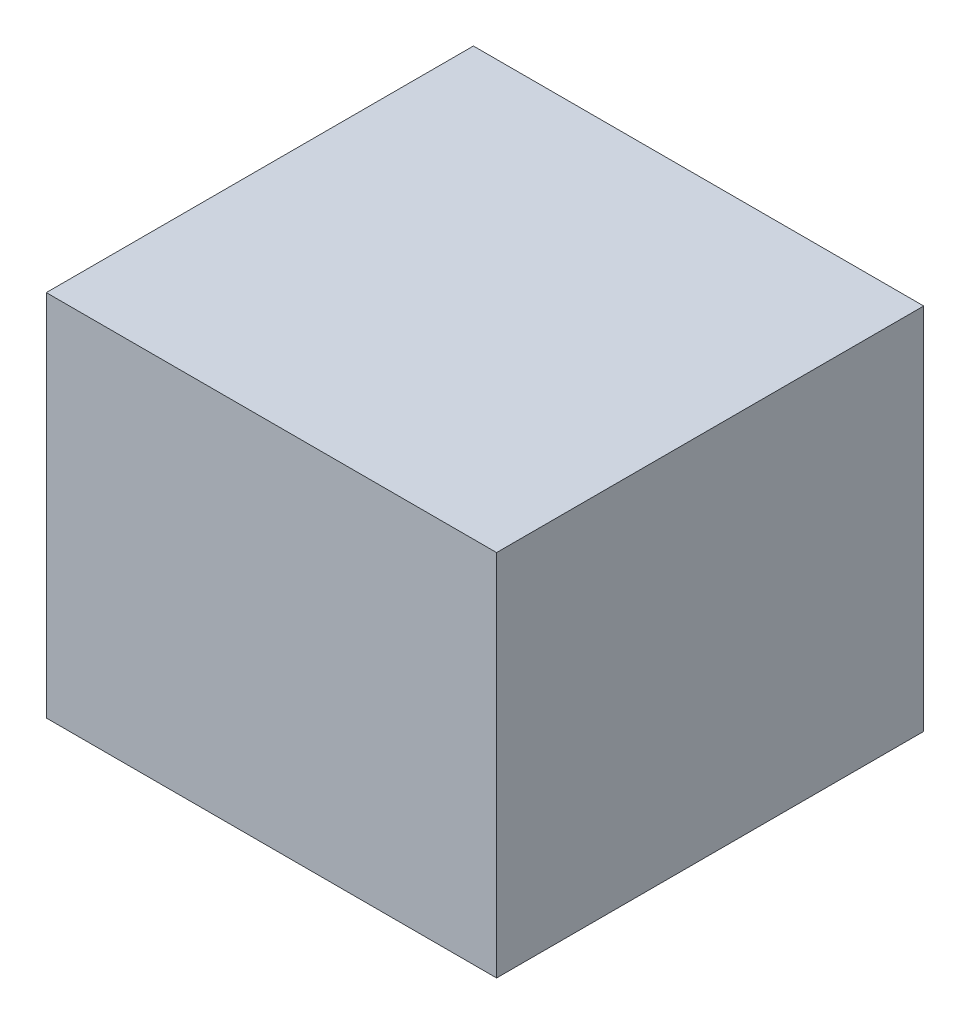
ISO-10303-21;
HEADER;
FILE_DESCRIPTION(('STEP AP214'),'2;1');
FILE_NAME('part.step','',(''),(''),'','','');
FILE_SCHEMA(('AUTOMOTIVE_DESIGN { 1 0 10303 214 1 1 1 1 }'));
ENDSEC;
DATA;
#1=APPLICATION_CONTEXT('core data for automotive mechanical design processes');
#2=APPLICATION_PROTOCOL_DEFINITION('international standard','automotive_design',2000,#1);
#3=PRODUCT_CONTEXT('',#1,'mechanical');
#4=PRODUCT('Part','Part','',(#3));
#5=PRODUCT_RELATED_PRODUCT_CATEGORY('part','',(#4));
#6=PRODUCT_DEFINITION_FORMATION('','',#4);
#7=PRODUCT_DEFINITION_CONTEXT('part definition',#1,'design');
#8=PRODUCT_DEFINITION('design','',#6,#7);
#9=PRODUCT_DEFINITION_SHAPE('','',#8);
#10=(LENGTH_UNIT() NAMED_UNIT(*) SI_UNIT(.MILLI.,.METRE.));
#11=(NAMED_UNIT(*) PLANE_ANGLE_UNIT() SI_UNIT($,.RADIAN.));
#12=(NAMED_UNIT(*) SI_UNIT($,.STERADIAN.) SOLID_ANGLE_UNIT());
#13=UNCERTAINTY_MEASURE_WITH_UNIT(LENGTH_MEASURE(1.E-05),#10,'distance_accuracy_value','');
#14=(GEOMETRIC_REPRESENTATION_CONTEXT(3) GLOBAL_UNCERTAINTY_ASSIGNED_CONTEXT((#13)) GLOBAL_UNIT_ASSIGNED_CONTEXT((#10,
#11,#12)) REPRESENTATION_CONTEXT('',''));
#15=CARTESIAN_POINT('',(0.,0.,0.));
#16=DIRECTION('',(0.,0.,1.));
#17=DIRECTION('',(1.,0.,0.));
#18=AXIS2_PLACEMENT_3D('',#15,#16,#17);
#19=CARTESIAN_POINT('',(8.25,-6.75,15.65));
#20=DIRECTION('',(-1.,0.,0.));
#21=DIRECTION('',(0.,0.,1.));
#22=AXIS2_PLACEMENT_3D('',#19,#20,#21);
#23=PLANE('',#22);
#24=DIRECTION('',(0.,1.,0.));
#25=VECTOR('',#24,1.);
#26=CARTESIAN_POINT('',(8.25,-6.75,0.));
#27=LINE('',#26,#25);
#28=CARTESIAN_POINT('',(8.25,-6.75,0.));
#29=VERTEX_POINT('',#28);
#30=CARTESIAN_POINT('',(8.25,6.75,0.));
#31=VERTEX_POINT('',#30);
#32=EDGE_CURVE('E137',#29,#31,#27,.T.);
#33=ORIENTED_EDGE('',*,*,#32,.T.);
#34=DIRECTION('',(0.,0.,-1.));
#35=VECTOR('',#34,1.);
#36=CARTESIAN_POINT('',(8.25,6.75,15.65));
#37=LINE('',#36,#35);
#38=CARTESIAN_POINT('',(8.25,6.75,15.65));
#39=VERTEX_POINT('',#38);
#40=EDGE_CURVE('E11',#39,#31,#37,.T.);
#41=ORIENTED_EDGE('',*,*,#40,.F.);
#42=DIRECTION('',(0.,1.,0.));
#43=VECTOR('',#42,1.);
#44=CARTESIAN_POINT('',(8.25,-6.75,15.65));
#45=LINE('',#44,#43);
#46=CARTESIAN_POINT('',(8.25,-6.75,15.65));
#47=VERTEX_POINT('',#46);
#48=EDGE_CURVE('E200',#47,#39,#45,.T.);
#49=ORIENTED_EDGE('',*,*,#48,.F.);
#50=DIRECTION('',(0.,0.,-1.));
#51=VECTOR('',#50,1.);
#52=CARTESIAN_POINT('',(8.25,-6.75,15.65));
#53=LINE('',#52,#51);
#54=EDGE_CURVE('E206',#47,#29,#53,.T.);
#55=ORIENTED_EDGE('',*,*,#54,.T.);
#56=EDGE_LOOP('',(#33,#41,#49,#55));
#57=FACE_BOUND('',#56,.T.);
#58=ADVANCED_FACE('F33',(#57),#23,.F.);
#59=CARTESIAN_POINT('',(-8.25,6.75,15.65));
#60=DIRECTION('',(0.,-1.,0.));
#61=DIRECTION('',(0.,0.,-1.));
#62=AXIS2_PLACEMENT_3D('',#59,#60,#61);
#63=PLANE('',#62);
#64=DIRECTION('',(-1.,0.,0.));
#65=VECTOR('',#64,1.);
#66=CARTESIAN_POINT('',(-8.25,6.75,0.));
#67=LINE('',#66,#65);
#68=CARTESIAN_POINT('',(-8.25,6.75,0.));
#69=VERTEX_POINT('',#68);
#70=EDGE_CURVE('E209',#31,#69,#67,.T.);
#71=ORIENTED_EDGE('',*,*,#70,.T.);
#72=DIRECTION('',(0.,0.,-1.));
#73=VECTOR('',#72,1.);
#74=CARTESIAN_POINT('',(-8.25,6.75,15.65));
#75=LINE('',#74,#73);
#76=CARTESIAN_POINT('',(-8.25,6.75,15.65));
#77=VERTEX_POINT('',#76);
#78=EDGE_CURVE('E40',#77,#69,#75,.T.);
#79=ORIENTED_EDGE('',*,*,#78,.F.);
#80=DIRECTION('',(-1.,0.,0.));
#81=VECTOR('',#80,1.);
#82=CARTESIAN_POINT('',(-8.25,6.75,15.65));
#83=LINE('',#82,#81);
#84=EDGE_CURVE('E84',#39,#77,#83,.T.);
#85=ORIENTED_EDGE('',*,*,#84,.F.);
#86=ORIENTED_EDGE('',*,*,#40,.T.);
#87=EDGE_LOOP('',(#71,#79,#85,#86));
#88=FACE_BOUND('',#87,.T.);
#89=ADVANCED_FACE('F237',(#88),#63,.F.);
#90=CARTESIAN_POINT('',(-8.25,-6.75,15.65));
#91=DIRECTION('',(1.,0.,0.));
#92=DIRECTION('',(0.,0.,-1.));
#93=AXIS2_PLACEMENT_3D('',#90,#91,#92);
#94=PLANE('',#93);
#95=DIRECTION('',(0.,-1.,0.));
#96=VECTOR('',#95,1.);
#97=CARTESIAN_POINT('',(-8.25,-6.75,0.));
#98=LINE('',#97,#96);
#99=CARTESIAN_POINT('',(-8.25,-6.75,0.));
#100=VERTEX_POINT('',#99);
#101=EDGE_CURVE('E211',#69,#100,#98,.T.);
#102=ORIENTED_EDGE('',*,*,#101,.T.);
#103=DIRECTION('',(0.,0.,-1.));
#104=VECTOR('',#103,1.);
#105=CARTESIAN_POINT('',(-8.25,-6.75,15.65));
#106=LINE('',#105,#104);
#107=CARTESIAN_POINT('',(-8.25,-6.75,15.65));
#108=VERTEX_POINT('',#107);
#109=EDGE_CURVE('E215',#108,#100,#106,.T.);
#110=ORIENTED_EDGE('',*,*,#109,.F.);
#111=DIRECTION('',(0.,-1.,0.));
#112=VECTOR('',#111,1.);
#113=CARTESIAN_POINT('',(-8.25,-6.75,15.65));
#114=LINE('',#113,#112);
#115=EDGE_CURVE('E203',#77,#108,#114,.T.);
#116=ORIENTED_EDGE('',*,*,#115,.F.);
#117=ORIENTED_EDGE('',*,*,#78,.T.);
#118=EDGE_LOOP('',(#102,#110,#116,#117));
#119=FACE_BOUND('',#118,.T.);
#120=ADVANCED_FACE('F220',(#119),#94,.F.);
#121=CARTESIAN_POINT('',(-8.25,-6.75,15.65));
#122=DIRECTION('',(0.,1.,0.));
#123=DIRECTION('',(0.,0.,1.));
#124=AXIS2_PLACEMENT_3D('',#121,#122,#123);
#125=PLANE('',#124);
#126=DIRECTION('',(1.,0.,0.));
#127=VECTOR('',#126,1.);
#128=CARTESIAN_POINT('',(-8.25,-6.75,0.));
#129=LINE('',#128,#127);
#130=EDGE_CURVE('E77',#100,#29,#129,.T.);
#131=ORIENTED_EDGE('',*,*,#130,.T.);
#132=ORIENTED_EDGE('',*,*,#54,.F.);
#133=DIRECTION('',(1.,0.,0.));
#134=VECTOR('',#133,1.);
#135=CARTESIAN_POINT('',(-8.25,-6.75,15.65));
#136=LINE('',#135,#134);
#137=EDGE_CURVE('E56',#108,#47,#136,.T.);
#138=ORIENTED_EDGE('',*,*,#137,.F.);
#139=ORIENTED_EDGE('',*,*,#109,.T.);
#140=EDGE_LOOP('',(#131,#132,#138,#139));
#141=FACE_BOUND('',#140,.T.);
#142=ADVANCED_FACE('F228',(#141),#125,.F.);
#143=CARTESIAN_POINT('',(0.,0.,15.65));
#144=DIRECTION('',(0.,0.,-1.));
#145=DIRECTION('',(-1.,0.,0.));
#146=AXIS2_PLACEMENT_3D('',#143,#144,#145);
#147=PLANE('',#146);
#148=ORIENTED_EDGE('',*,*,#48,.T.);
#149=ORIENTED_EDGE('',*,*,#84,.T.);
#150=ORIENTED_EDGE('',*,*,#115,.T.);
#151=ORIENTED_EDGE('',*,*,#137,.T.);
#152=EDGE_LOOP('',(#148,#149,#150,#151));
#153=FACE_BOUND('',#152,.T.);
#154=ADVANCED_FACE('F230',(#153),#147,.F.);
#155=CARTESIAN_POINT('',(0.,0.,0.));
#156=DIRECTION('',(0.,0.,-1.));
#157=DIRECTION('',(-1.,0.,0.));
#158=AXIS2_PLACEMENT_3D('',#155,#156,#157);
#159=PLANE('',#158);
#160=DIRECTION('',(1.,0.,0.));
#161=VECTOR('',#160,1.);
#162=CARTESIAN_POINT('',(0.,3.15,0.));
#163=LINE('',#162,#161);
#164=CARTESIAN_POINT('',(3.2,3.15,0.));
#165=VERTEX_POINT('',#164);
#166=CARTESIAN_POINT('',(6.25,3.15,0.));
#167=VERTEX_POINT('',#166);
#168=EDGE_CURVE('E47',#165,#167,#163,.T.);
#169=ORIENTED_EDGE('',*,*,#168,.F.);
#170=DIRECTION('',(0.,1.,0.));
#171=VECTOR('',#170,1.);
#172=CARTESIAN_POINT('',(3.2,0.,0.));
#173=LINE('',#172,#171);
#174=CARTESIAN_POINT('',(3.2,5.75,0.));
#175=VERTEX_POINT('',#174);
#176=EDGE_CURVE('E135',#165,#175,#173,.T.);
#177=ORIENTED_EDGE('',*,*,#176,.T.);
#178=DIRECTION('',(1.,0.,0.));
#179=VECTOR('',#178,1.);
#180=CARTESIAN_POINT('',(0.,5.75,0.));
#181=LINE('',#180,#179);
#182=CARTESIAN_POINT('',(-3.2,5.75,0.));
#183=VERTEX_POINT('',#182);
#184=EDGE_CURVE('E177',#183,#175,#181,.T.);
#185=ORIENTED_EDGE('',*,*,#184,.F.);
#186=DIRECTION('',(0.,1.,0.));
#187=VECTOR('',#186,1.);
#188=CARTESIAN_POINT('',(-3.2,0.,0.));
#189=LINE('',#188,#187);
#190=CARTESIAN_POINT('',(-3.2,3.15,0.));
#191=VERTEX_POINT('',#190);
#192=EDGE_CURVE('E180',#191,#183,#189,.T.);
#193=ORIENTED_EDGE('',*,*,#192,.F.);
#194=CARTESIAN_POINT('',(-6.25,3.15,0.));
#195=VERTEX_POINT('',#194);
#196=EDGE_CURVE('E175',#195,#191,#163,.T.);
#197=ORIENTED_EDGE('',*,*,#196,.F.);
#198=DIRECTION('',(0.,-1.,0.));
#199=VECTOR('',#198,1.);
#200=CARTESIAN_POINT('',(-6.25,0.,0.));
#201=LINE('',#200,#199);
#202=CARTESIAN_POINT('',(-6.25,-4.85,0.));
#203=VERTEX_POINT('',#202);
#204=EDGE_CURVE('E183',#195,#203,#201,.T.);
#205=ORIENTED_EDGE('',*,*,#204,.T.);
#206=DIRECTION('',(-1.,0.,0.));
#207=VECTOR('',#206,1.);
#208=CARTESIAN_POINT('',(0.,-4.85,0.));
#209=LINE('',#208,#207);
#210=CARTESIAN_POINT('',(6.25,-4.85,0.));
#211=VERTEX_POINT('',#210);
#212=EDGE_CURVE('E157',#211,#203,#209,.T.);
#213=ORIENTED_EDGE('',*,*,#212,.F.);
#214=DIRECTION('',(0.,-1.,0.));
#215=VECTOR('',#214,1.);
#216=CARTESIAN_POINT('',(6.25,0.,0.));
#217=LINE('',#216,#215);
#218=EDGE_CURVE('E153',#167,#211,#217,.T.);
#219=ORIENTED_EDGE('',*,*,#218,.F.);
#220=EDGE_LOOP('',(#169,#177,#185,#193,#197,#205,#213,#219));
#221=FACE_BOUND('',#220,.T.);
#222=ORIENTED_EDGE('',*,*,#32,.F.);
#223=ORIENTED_EDGE('',*,*,#130,.F.);
#224=ORIENTED_EDGE('',*,*,#101,.F.);
#225=ORIENTED_EDGE('',*,*,#70,.F.);
#226=EDGE_LOOP('',(#222,#223,#224,#225));
#227=FACE_BOUND('',#226,.T.);
#228=ADVANCED_FACE('F224',(#221,#227),#159,.T.);
#229=CARTESIAN_POINT('',(0.,3.15,10.));
#230=DIRECTION('',(0.,1.,0.));
#231=DIRECTION('',(0.,0.,1.));
#232=AXIS2_PLACEMENT_3D('',#229,#230,#231);
#233=PLANE('',#232);
#234=ORIENTED_EDGE('',*,*,#168,.T.);
#235=DIRECTION('',(0.,0.,-1.));
#236=VECTOR('',#235,1.);
#237=CARTESIAN_POINT('',(6.25,3.15,10.));
#238=LINE('',#237,#236);
#239=CARTESIAN_POINT('',(6.25,3.15,10.));
#240=VERTEX_POINT('',#239);
#241=EDGE_CURVE('E152',#240,#167,#238,.T.);
#242=ORIENTED_EDGE('',*,*,#241,.F.);
#243=DIRECTION('',(1.,0.,0.));
#244=VECTOR('',#243,1.);
#245=CARTESIAN_POINT('',(0.,3.15,10.));
#246=LINE('',#245,#244);
#247=CARTESIAN_POINT('',(3.2,3.15,10.));
#248=VERTEX_POINT('',#247);
#249=EDGE_CURVE('E145',#248,#240,#246,.T.);
#250=ORIENTED_EDGE('',*,*,#249,.F.);
#251=DIRECTION('',(0.,0.,-1.));
#252=VECTOR('',#251,1.);
#253=CARTESIAN_POINT('',(3.2,3.15,10.));
#254=LINE('',#253,#252);
#255=EDGE_CURVE('E129',#248,#165,#254,.T.);
#256=ORIENTED_EDGE('',*,*,#255,.T.);
#257=EDGE_LOOP('',(#234,#242,#250,#256));
#258=FACE_BOUND('',#257,.T.);
#259=ADVANCED_FACE('F151',(#258),#233,.F.);
#260=CARTESIAN_POINT('',(3.2,0.,10.));
#261=DIRECTION('',(-1.,0.,0.));
#262=DIRECTION('',(0.,0.,1.));
#263=AXIS2_PLACEMENT_3D('',#260,#261,#262);
#264=PLANE('',#263);
#265=ORIENTED_EDGE('',*,*,#176,.F.);
#266=ORIENTED_EDGE('',*,*,#255,.F.);
#267=DIRECTION('',(0.,1.,0.));
#268=VECTOR('',#267,1.);
#269=CARTESIAN_POINT('',(3.2,0.,10.));
#270=LINE('',#269,#268);
#271=CARTESIAN_POINT('',(3.2,5.75,10.));
#272=VERTEX_POINT('',#271);
#273=EDGE_CURVE('E132',#248,#272,#270,.T.);
#274=ORIENTED_EDGE('',*,*,#273,.T.);
#275=DIRECTION('',(0.,0.,-1.));
#276=VECTOR('',#275,1.);
#277=CARTESIAN_POINT('',(3.2,5.75,10.));
#278=LINE('',#277,#276);
#279=EDGE_CURVE('E138',#272,#175,#278,.T.);
#280=ORIENTED_EDGE('',*,*,#279,.T.);
#281=EDGE_LOOP('',(#265,#266,#274,#280));
#282=FACE_BOUND('',#281,.T.);
#283=ADVANCED_FACE('F131',(#282),#264,.T.);
#284=CARTESIAN_POINT('',(0.,5.75,10.));
#285=DIRECTION('',(0.,1.,0.));
#286=DIRECTION('',(0.,0.,1.));
#287=AXIS2_PLACEMENT_3D('',#284,#285,#286);
#288=PLANE('',#287);
#289=ORIENTED_EDGE('',*,*,#184,.T.);
#290=ORIENTED_EDGE('',*,*,#279,.F.);
#291=DIRECTION('',(1.,0.,0.));
#292=VECTOR('',#291,1.);
#293=CARTESIAN_POINT('',(0.,5.75,10.));
#294=LINE('',#293,#292);
#295=CARTESIAN_POINT('',(-3.2,5.75,10.));
#296=VERTEX_POINT('',#295);
#297=EDGE_CURVE('E149',#296,#272,#294,.T.);
#298=ORIENTED_EDGE('',*,*,#297,.F.);
#299=DIRECTION('',(0.,0.,-1.));
#300=VECTOR('',#299,1.);
#301=CARTESIAN_POINT('',(-3.2,5.75,10.));
#302=LINE('',#301,#300);
#303=EDGE_CURVE('E197',#296,#183,#302,.T.);
#304=ORIENTED_EDGE('',*,*,#303,.T.);
#305=EDGE_LOOP('',(#289,#290,#298,#304));
#306=FACE_BOUND('',#305,.T.);
#307=ADVANCED_FACE('F286',(#306),#288,.F.);
#308=CARTESIAN_POINT('',(-3.2,0.,10.));
#309=DIRECTION('',(-1.,0.,0.));
#310=DIRECTION('',(0.,0.,1.));
#311=AXIS2_PLACEMENT_3D('',#308,#309,#310);
#312=PLANE('',#311);
#313=ORIENTED_EDGE('',*,*,#192,.T.);
#314=ORIENTED_EDGE('',*,*,#303,.F.);
#315=DIRECTION('',(0.,1.,0.));
#316=VECTOR('',#315,1.);
#317=CARTESIAN_POINT('',(-3.2,0.,10.));
#318=LINE('',#317,#316);
#319=CARTESIAN_POINT('',(-3.2,3.15,10.));
#320=VERTEX_POINT('',#319);
#321=EDGE_CURVE('E161',#320,#296,#318,.T.);
#322=ORIENTED_EDGE('',*,*,#321,.F.);
#323=DIRECTION('',(0.,0.,-1.));
#324=VECTOR('',#323,1.);
#325=CARTESIAN_POINT('',(-3.2,3.15,10.));
#326=LINE('',#325,#324);
#327=EDGE_CURVE('E195',#320,#191,#326,.T.);
#328=ORIENTED_EDGE('',*,*,#327,.T.);
#329=EDGE_LOOP('',(#313,#314,#322,#328));
#330=FACE_BOUND('',#329,.T.);
#331=ADVANCED_FACE('F295',(#330),#312,.F.);
#332=ORIENTED_EDGE('',*,*,#196,.T.);
#333=ORIENTED_EDGE('',*,*,#327,.F.);
#334=CARTESIAN_POINT('',(-6.25,3.15,10.));
#335=VERTEX_POINT('',#334);
#336=EDGE_CURVE('E155',#335,#320,#246,.T.);
#337=ORIENTED_EDGE('',*,*,#336,.F.);
#338=DIRECTION('',(0.,0.,-1.));
#339=VECTOR('',#338,1.);
#340=CARTESIAN_POINT('',(-6.25,3.15,10.));
#341=LINE('',#340,#339);
#342=EDGE_CURVE('E193',#335,#195,#341,.T.);
#343=ORIENTED_EDGE('',*,*,#342,.T.);
#344=EDGE_LOOP('',(#332,#333,#337,#343));
#345=FACE_BOUND('',#344,.T.);
#346=ADVANCED_FACE('F278',(#345),#233,.F.);
#347=CARTESIAN_POINT('',(-6.25,0.,10.));
#348=DIRECTION('',(1.,0.,0.));
#349=DIRECTION('',(0.,0.,-1.));
#350=AXIS2_PLACEMENT_3D('',#347,#348,#349);
#351=PLANE('',#350);
#352=ORIENTED_EDGE('',*,*,#204,.F.);
#353=ORIENTED_EDGE('',*,*,#342,.F.);
#354=DIRECTION('',(0.,-1.,0.));
#355=VECTOR('',#354,1.);
#356=CARTESIAN_POINT('',(-6.25,0.,10.));
#357=LINE('',#356,#355);
#358=CARTESIAN_POINT('',(-6.25,-4.85,10.));
#359=VERTEX_POINT('',#358);
#360=EDGE_CURVE('E160',#335,#359,#357,.T.);
#361=ORIENTED_EDGE('',*,*,#360,.T.);
#362=DIRECTION('',(0.,0.,-1.));
#363=VECTOR('',#362,1.);
#364=CARTESIAN_POINT('',(-6.25,-4.85,10.));
#365=LINE('',#364,#363);
#366=EDGE_CURVE('E191',#359,#203,#365,.T.);
#367=ORIENTED_EDGE('',*,*,#366,.T.);
#368=EDGE_LOOP('',(#352,#353,#361,#367));
#369=FACE_BOUND('',#368,.T.);
#370=ADVANCED_FACE('F314',(#369),#351,.T.);
#371=CARTESIAN_POINT('',(0.,-4.85,10.));
#372=DIRECTION('',(0.,-1.,0.));
#373=DIRECTION('',(0.,0.,-1.));
#374=AXIS2_PLACEMENT_3D('',#371,#372,#373);
#375=PLANE('',#374);
#376=ORIENTED_EDGE('',*,*,#212,.T.);
#377=ORIENTED_EDGE('',*,*,#366,.F.);
#378=DIRECTION('',(-1.,0.,0.));
#379=VECTOR('',#378,1.);
#380=CARTESIAN_POINT('',(0.,-4.85,10.));
#381=LINE('',#380,#379);
#382=CARTESIAN_POINT('',(6.25,-4.85,10.));
#383=VERTEX_POINT('',#382);
#384=EDGE_CURVE('E164',#383,#359,#381,.T.);
#385=ORIENTED_EDGE('',*,*,#384,.F.);
#386=DIRECTION('',(0.,0.,-1.));
#387=VECTOR('',#386,1.);
#388=CARTESIAN_POINT('',(6.25,-4.85,10.));
#389=LINE('',#388,#387);
#390=EDGE_CURVE('E189',#383,#211,#389,.T.);
#391=ORIENTED_EDGE('',*,*,#390,.T.);
#392=EDGE_LOOP('',(#376,#377,#385,#391));
#393=FACE_BOUND('',#392,.T.);
#394=ADVANCED_FACE('F323',(#393),#375,.F.);
#395=CARTESIAN_POINT('',(6.25,0.,10.));
#396=DIRECTION('',(1.,0.,0.));
#397=DIRECTION('',(0.,0.,-1.));
#398=AXIS2_PLACEMENT_3D('',#395,#396,#397);
#399=PLANE('',#398);
#400=ORIENTED_EDGE('',*,*,#218,.T.);
#401=ORIENTED_EDGE('',*,*,#390,.F.);
#402=DIRECTION('',(0.,-1.,0.));
#403=VECTOR('',#402,1.);
#404=CARTESIAN_POINT('',(6.25,0.,10.));
#405=LINE('',#404,#403);
#406=EDGE_CURVE('E172',#240,#383,#405,.T.);
#407=ORIENTED_EDGE('',*,*,#406,.F.);
#408=ORIENTED_EDGE('',*,*,#241,.T.);
#409=EDGE_LOOP('',(#400,#401,#407,#408));
#410=FACE_BOUND('',#409,.T.);
#411=ADVANCED_FACE('F333',(#410),#399,.F.);
#412=CARTESIAN_POINT('',(0.,0.,10.));
#413=DIRECTION('',(0.,0.,1.));
#414=DIRECTION('',(1.,0.,0.));
#415=AXIS2_PLACEMENT_3D('',#412,#413,#414);
#416=PLANE('',#415);
#417=ORIENTED_EDGE('',*,*,#249,.T.);
#418=ORIENTED_EDGE('',*,*,#406,.T.);
#419=ORIENTED_EDGE('',*,*,#384,.T.);
#420=ORIENTED_EDGE('',*,*,#360,.F.);
#421=ORIENTED_EDGE('',*,*,#336,.T.);
#422=ORIENTED_EDGE('',*,*,#321,.T.);
#423=ORIENTED_EDGE('',*,*,#297,.T.);
#424=ORIENTED_EDGE('',*,*,#273,.F.);
#425=EDGE_LOOP('',(#417,#418,#419,#420,#421,#422,#423,#424));
#426=FACE_BOUND('',#425,.T.);
#427=ADVANCED_FACE('F143',(#426),#416,.F.);
#428=CLOSED_SHELL('',(#58,#89,#120,#142,#154,#228,#259,#283,#307,#331,#346,#370,#394,#411,#427));
#429=MANIFOLD_SOLID_BREP('B2',#428);
#430=ADVANCED_BREP_SHAPE_REPRESENTATION('',(#18,#429),#14);
#431=SHAPE_DEFINITION_REPRESENTATION(#9,#430);
ENDSEC;
END-ISO-10303-21;
